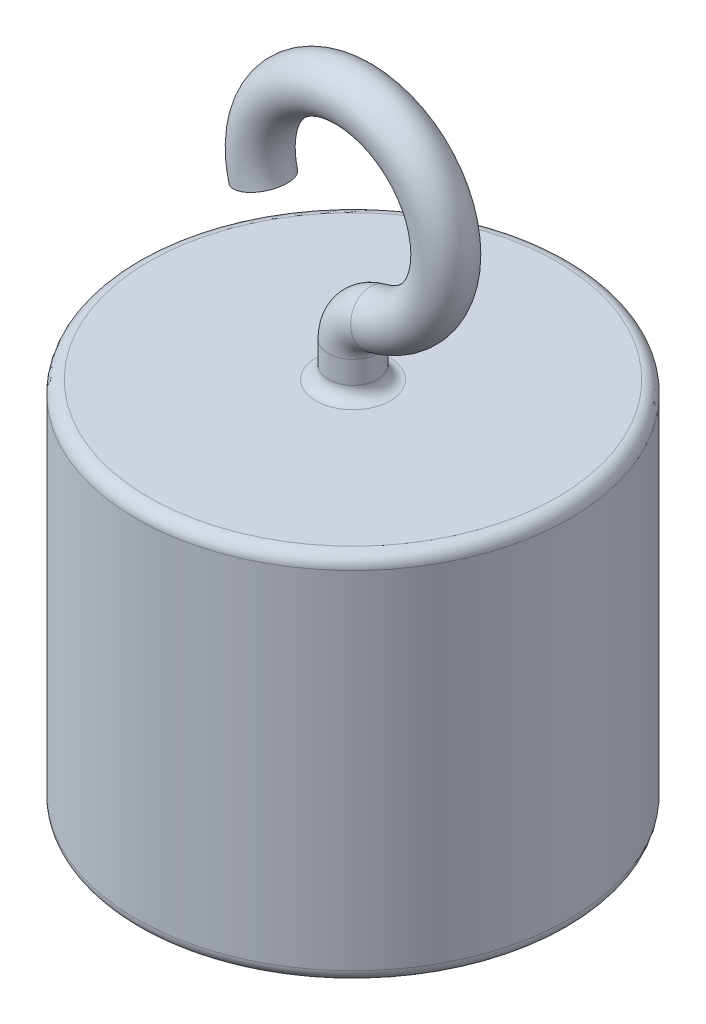
ISO-10303-21;
HEADER;
FILE_DESCRIPTION(('STEP AP214'),'2;1');
FILE_NAME('part.step','',(''),(''),'','','');
FILE_SCHEMA(('AUTOMOTIVE_DESIGN { 1 0 10303 214 1 1 1 1 }'));
ENDSEC;
DATA;
#1=APPLICATION_CONTEXT('core data for automotive mechanical design processes');
#2=APPLICATION_PROTOCOL_DEFINITION('international standard','automotive_design',2000,#1);
#3=PRODUCT_CONTEXT('',#1,'mechanical');
#4=PRODUCT('Part','Part','',(#3));
#5=PRODUCT_RELATED_PRODUCT_CATEGORY('part','',(#4));
#6=PRODUCT_DEFINITION_FORMATION('','',#4);
#7=PRODUCT_DEFINITION_CONTEXT('part definition',#1,'design');
#8=PRODUCT_DEFINITION('design','',#6,#7);
#9=PRODUCT_DEFINITION_SHAPE('','',#8);
#10=(LENGTH_UNIT() NAMED_UNIT(*) SI_UNIT(.MILLI.,.METRE.));
#11=(NAMED_UNIT(*) PLANE_ANGLE_UNIT() SI_UNIT($,.RADIAN.));
#12=(NAMED_UNIT(*) SI_UNIT($,.STERADIAN.) SOLID_ANGLE_UNIT());
#13=UNCERTAINTY_MEASURE_WITH_UNIT(LENGTH_MEASURE(1.E-05),#10,'distance_accuracy_value','');
#14=(GEOMETRIC_REPRESENTATION_CONTEXT(3) GLOBAL_UNCERTAINTY_ASSIGNED_CONTEXT((#13)) GLOBAL_UNIT_ASSIGNED_CONTEXT((#10,
#11,#12)) REPRESENTATION_CONTEXT('',''));
#15=CARTESIAN_POINT('',(0.,0.,0.));
#16=DIRECTION('',(0.,0.,1.));
#17=DIRECTION('',(1.,0.,0.));
#18=AXIS2_PLACEMENT_3D('',#15,#16,#17);
#19=CARTESIAN_POINT('',(0.,30.,0.));
#20=DIRECTION('',(0.,1.,0.));
#21=DIRECTION('',(-1.,0.,0.));
#22=AXIS2_PLACEMENT_3D('',#19,#20,#21);
#23=CYLINDRICAL_SURFACE('',#22,35.);
#24=CARTESIAN_POINT('',(0.,-28.,0.));
#25=DIRECTION('',(0.,-1.,0.));
#26=DIRECTION('',(1.,0.,0.));
#27=AXIS2_PLACEMENT_3D('',#24,#25,#26);
#28=CIRCLE('',#27,35.);
#29=CARTESIAN_POINT('',(35.,-28.,0.));
#30=VERTEX_POINT('',#29);
#31=EDGE_CURVE('E53',#30,#30,#28,.F.);
#32=ORIENTED_EDGE('',*,*,#31,.T.);
#33=EDGE_LOOP('',(#32));
#34=FACE_BOUND('',#33,.T.);
#35=CARTESIAN_POINT('',(0.,28.,0.));
#36=DIRECTION('',(0.,-1.,0.));
#37=DIRECTION('',(1.,0.,0.));
#38=AXIS2_PLACEMENT_3D('',#35,#36,#37);
#39=CIRCLE('',#38,35.);
#40=CARTESIAN_POINT('',(35.,28.,0.));
#41=VERTEX_POINT('',#40);
#42=EDGE_CURVE('E56',#41,#41,#39,.T.);
#43=ORIENTED_EDGE('',*,*,#42,.T.);
#44=EDGE_LOOP('',(#43));
#45=FACE_BOUND('',#44,.T.);
#46=ADVANCED_FACE('F33',(#34,#45),#23,.T.);
#47=CARTESIAN_POINT('',(0.,30.,0.));
#48=DIRECTION('',(0.,-1.,0.));
#49=DIRECTION('',(1.,0.,0.));
#50=AXIS2_PLACEMENT_3D('',#47,#48,#49);
#51=PLANE('',#50);
#52=CARTESIAN_POINT('',(0.,30.,0.));
#53=DIRECTION('',(0.,-1.,0.));
#54=DIRECTION('',(1.,0.,0.));
#55=AXIS2_PLACEMENT_3D('',#52,#53,#54);
#56=CIRCLE('',#55,6.);
#57=CARTESIAN_POINT('',(5.99999999999999,30.,0.));
#58=VERTEX_POINT('',#57);
#59=EDGE_CURVE('E10',#58,#58,#56,.T.);
#60=ORIENTED_EDGE('',*,*,#59,.T.);
#61=EDGE_LOOP('',(#60));
#62=FACE_BOUND('',#61,.T.);
#63=CARTESIAN_POINT('',(0.,30.,0.));
#64=DIRECTION('',(0.,-1.,0.));
#65=DIRECTION('',(1.,0.,0.));
#66=AXIS2_PLACEMENT_3D('',#63,#64,#65);
#67=CIRCLE('',#66,33.);
#68=CARTESIAN_POINT('',(33.,30.,0.));
#69=VERTEX_POINT('',#68);
#70=EDGE_CURVE('E44',#69,#69,#67,.F.);
#71=ORIENTED_EDGE('',*,*,#70,.T.);
#72=EDGE_LOOP('',(#71));
#73=FACE_BOUND('',#72,.T.);
#74=ADVANCED_FACE('F87',(#62,#73),#51,.F.);
#75=CARTESIAN_POINT('',(0.,-30.,0.));
#76=DIRECTION('',(0.,-1.,0.));
#77=DIRECTION('',(1.,0.,0.));
#78=AXIS2_PLACEMENT_3D('',#75,#76,#77);
#79=PLANE('',#78);
#80=CARTESIAN_POINT('',(0.,-30.,0.));
#81=DIRECTION('',(0.,-1.,0.));
#82=DIRECTION('',(0.,0.,-1.));
#83=AXIS2_PLACEMENT_3D('',#80,#81,#82);
#84=CIRCLE('',#83,20.);
#85=CARTESIAN_POINT('',(0.,-30.,-20.));
#86=VERTEX_POINT('',#85);
#87=EDGE_CURVE('E77',#86,#86,#84,.T.);
#88=ORIENTED_EDGE('',*,*,#87,.F.);
#89=EDGE_LOOP('',(#88));
#90=FACE_BOUND('',#89,.T.);
#91=CARTESIAN_POINT('',(0.,-30.,0.));
#92=DIRECTION('',(0.,-1.,0.));
#93=DIRECTION('',(1.,0.,0.));
#94=AXIS2_PLACEMENT_3D('',#91,#92,#93);
#95=CIRCLE('',#94,33.);
#96=CARTESIAN_POINT('',(33.,-30.,0.));
#97=VERTEX_POINT('',#96);
#98=EDGE_CURVE('E48',#97,#97,#95,.T.);
#99=ORIENTED_EDGE('',*,*,#98,.T.);
#100=EDGE_LOOP('',(#99));
#101=FACE_BOUND('',#100,.T.);
#102=ADVANCED_FACE('F83',(#90,#101),#79,.T.);
#103=CARTESIAN_POINT('',(0.,-28.,0.));
#104=DIRECTION('',(0.,-1.,0.));
#105=DIRECTION('',(1.,0.,0.));
#106=AXIS2_PLACEMENT_3D('',#103,#104,#105);
#107=TOROIDAL_SURFACE('',#106,33.,2.);
#108=ORIENTED_EDGE('',*,*,#98,.F.);
#109=EDGE_LOOP('',(#108));
#110=FACE_BOUND('',#109,.T.);
#111=ORIENTED_EDGE('',*,*,#31,.F.);
#112=EDGE_LOOP('',(#111));
#113=FACE_BOUND('',#112,.T.);
#114=ADVANCED_FACE('F86',(#110,#113),#107,.T.);
#115=CARTESIAN_POINT('',(0.,28.,0.));
#116=DIRECTION('',(0.,-1.,0.));
#117=DIRECTION('',(1.,0.,0.));
#118=AXIS2_PLACEMENT_3D('',#115,#116,#117);
#119=TOROIDAL_SURFACE('',#118,33.,2.);
#120=ORIENTED_EDGE('',*,*,#42,.F.);
#121=EDGE_LOOP('',(#120));
#122=FACE_BOUND('',#121,.T.);
#123=ORIENTED_EDGE('',*,*,#70,.F.);
#124=EDGE_LOOP('',(#123));
#125=FACE_BOUND('',#124,.T.);
#126=ADVANCED_FACE('F93',(#122,#125),#119,.T.);
#127=CARTESIAN_POINT('',(-14.488887394336,51.1177143234623,0.));
#128=DIRECTION('',(0.258819045102515,-0.96592582628907,0.));
#129=DIRECTION('',(0.96592582628907,0.258819045102515,0.));
#130=AXIS2_PLACEMENT_3D('',#127,#128,#129);
#131=PLANE('',#130);
#132=CARTESIAN_POINT('',(-14.488887394336,51.1177143234623,0.));
#133=DIRECTION('',(0.258819045102515,-0.96592582628907,0.));
#134=DIRECTION('',(0.96592582628907,0.258819045102515,0.));
#135=AXIS2_PLACEMENT_3D('',#132,#133,#134);
#136=CIRCLE('',#135,4.);
#137=CARTESIAN_POINT('',(-10.6251840891798,52.1529905038723,0.));
#138=VERTEX_POINT('',#137);
#139=EDGE_CURVE('E59',#138,#138,#136,.T.);
#140=ORIENTED_EDGE('',*,*,#139,.T.);
#141=EDGE_LOOP('',(#140));
#142=FACE_BOUND('',#141,.T.);
#143=ADVANCED_FACE('F104',(#142),#131,.T.);
#144=CARTESIAN_POINT('',(0.,30.,0.));
#145=DIRECTION('',(0.,1.,0.));
#146=DIRECTION('',(0.,0.,1.));
#147=AXIS2_PLACEMENT_3D('',#144,#145,#146);
#148=CYLINDRICAL_SURFACE('',#147,4.);
#149=CARTESIAN_POINT('',(0.,32.,0.));
#150=DIRECTION('',(0.,-1.,0.));
#151=DIRECTION('',(1.,0.,0.));
#152=AXIS2_PLACEMENT_3D('',#149,#150,#151);
#153=CIRCLE('',#152,4.);
#154=CARTESIAN_POINT('',(3.99999999999999,32.,0.));
#155=VERTEX_POINT('',#154);
#156=EDGE_CURVE('E40',#155,#155,#153,.F.);
#157=ORIENTED_EDGE('',*,*,#156,.T.);
#158=EDGE_LOOP('',(#157));
#159=FACE_BOUND('',#158,.T.);
#160=CARTESIAN_POINT('',(0.,35.6350832689629,0.));
#161=DIRECTION('',(0.,1.,0.));
#162=DIRECTION('',(-1.,0.,0.));
#163=AXIS2_PLACEMENT_3D('',#160,#161,#162);
#164=CIRCLE('',#163,4.);
#165=CARTESIAN_POINT('',(-4.,35.6350832689629,0.));
#166=VERTEX_POINT('',#165);
#167=EDGE_CURVE('E65',#166,#166,#164,.T.);
#168=ORIENTED_EDGE('',*,*,#167,.F.);
#169=EDGE_LOOP('',(#168));
#170=FACE_BOUND('',#169,.T.);
#171=ADVANCED_FACE('F115',(#159,#170),#148,.T.);
#172=CARTESIAN_POINT('',(5.,35.6350832689629,0.));
#173=DIRECTION('',(0.,0.,-1.));
#174=DIRECTION('',(-1.,0.,0.));
#175=AXIS2_PLACEMENT_3D('',#172,#173,#174);
#176=TOROIDAL_SURFACE('',#175,5.,4.);
#177=CARTESIAN_POINT('',(3.74999999999999,40.4763124517222,0.));
#178=DIRECTION('',(0.968245836551854,0.250000000000001,0.));
#179=DIRECTION('',(-0.250000000000001,0.968245836551854,0.));
#180=AXIS2_PLACEMENT_3D('',#177,#178,#179);
#181=CIRCLE('',#180,4.);
#182=CARTESIAN_POINT('',(2.74999999999999,44.3492957979296,0.));
#183=VERTEX_POINT('',#182);
#184=EDGE_CURVE('E62',#183,#183,#181,.T.);
#185=CARTESIAN_POINT('',(5.,35.6350832689629,0.));
#186=DIRECTION('',(0.,0.,-1.));
#187=DIRECTION('',(-1.,0.,0.));
#188=AXIS2_PLACEMENT_3D('',#185,#186,#187);
#189=CIRCLE('',#188,9.00000000000001);
#190=EDGE_CURVE('',#166,#183,#189,.T.);
#191=ORIENTED_EDGE('',*,*,#167,.T.);
#192=ORIENTED_EDGE('',*,*,#184,.F.);
#193=ORIENTED_EDGE('',*,*,#190,.T.);
#194=ORIENTED_EDGE('',*,*,#190,.F.);
#195=EDGE_LOOP('',(#191,#193,#192,#194));
#196=FACE_BOUND('',#195,.T.);
#197=ADVANCED_FACE('F119',(#196),#176,.T.);
#198=CARTESIAN_POINT('',(0.,55.,0.));
#199=DIRECTION('',(0.,0.,1.));
#200=DIRECTION('',(1.,0.,0.));
#201=AXIS2_PLACEMENT_3D('',#198,#199,#200);
#202=TOROIDAL_SURFACE('',#201,15.,4.);
#203=ORIENTED_EDGE('',*,*,#139,.F.);
#204=EDGE_LOOP('',(#203));
#205=FACE_BOUND('',#204,.T.);
#206=ORIENTED_EDGE('',*,*,#184,.T.);
#207=EDGE_LOOP('',(#206));
#208=FACE_BOUND('',#207,.T.);
#209=ADVANCED_FACE('F105',(#205,#208),#202,.T.);
#210=CARTESIAN_POINT('',(0.,32.,0.));
#211=DIRECTION('',(0.,-1.,0.));
#212=DIRECTION('',(1.,0.,0.));
#213=AXIS2_PLACEMENT_3D('',#210,#211,#212);
#214=TOROIDAL_SURFACE('',#213,6.,2.);
#215=ORIENTED_EDGE('',*,*,#59,.F.);
#216=EDGE_LOOP('',(#215));
#217=FACE_BOUND('',#216,.T.);
#218=ORIENTED_EDGE('',*,*,#156,.F.);
#219=EDGE_LOOP('',(#218));
#220=FACE_BOUND('',#219,.T.);
#221=ADVANCED_FACE('F35',(#217,#220),#214,.F.);
#222=CARTESIAN_POINT('',(0.,-20.,0.));
#223=DIRECTION('',(0.,1.,0.));
#224=DIRECTION('',(0.,0.,1.));
#225=AXIS2_PLACEMENT_3D('',#222,#223,#224);
#226=PLANE('',#225);
#227=CARTESIAN_POINT('',(0.,-20.,0.));
#228=DIRECTION('',(0.,-1.,0.));
#229=DIRECTION('',(0.,0.,-1.));
#230=AXIS2_PLACEMENT_3D('',#227,#228,#229);
#231=CIRCLE('',#230,3.);
#232=CARTESIAN_POINT('',(0.,-20.,-3.));
#233=VERTEX_POINT('',#232);
#234=EDGE_CURVE('E68',#233,#233,#231,.T.);
#235=ORIENTED_EDGE('',*,*,#234,.T.);
#236=EDGE_LOOP('',(#235));
#237=FACE_BOUND('',#236,.T.);
#238=ADVANCED_FACE('F126',(#237),#226,.F.);
#239=CARTESIAN_POINT('',(0.,-30.,0.));
#240=DIRECTION('',(0.,-1.,0.));
#241=DIRECTION('',(0.,0.,-1.));
#242=AXIS2_PLACEMENT_3D('',#239,#240,#241);
#243=CYLINDRICAL_SURFACE('',#242,3.);
#244=ORIENTED_EDGE('',*,*,#234,.F.);
#245=EDGE_LOOP('',(#244));
#246=FACE_BOUND('',#245,.T.);
#247=CARTESIAN_POINT('',(0.,-24.,0.));
#248=DIRECTION('',(0.,-1.,0.));
#249=DIRECTION('',(0.,0.,-1.));
#250=AXIS2_PLACEMENT_3D('',#247,#248,#249);
#251=CIRCLE('',#250,3.);
#252=CARTESIAN_POINT('',(0.,-24.,-3.));
#253=VERTEX_POINT('',#252);
#254=EDGE_CURVE('E71',#253,#253,#251,.T.);
#255=ORIENTED_EDGE('',*,*,#254,.T.);
#256=EDGE_LOOP('',(#255));
#257=FACE_BOUND('',#256,.T.);
#258=ADVANCED_FACE('F129',(#246,#257),#243,.F.);
#259=CARTESIAN_POINT('',(0.,-24.,0.));
#260=DIRECTION('',(0.,1.,0.));
#261=DIRECTION('',(0.,0.,1.));
#262=AXIS2_PLACEMENT_3D('',#259,#260,#261);
#263=PLANE('',#262);
#264=ORIENTED_EDGE('',*,*,#254,.F.);
#265=EDGE_LOOP('',(#264));
#266=FACE_BOUND('',#265,.T.);
#267=CARTESIAN_POINT('',(0.,-24.,0.));
#268=DIRECTION('',(0.,-1.,0.));
#269=DIRECTION('',(0.,0.,-1.));
#270=AXIS2_PLACEMENT_3D('',#267,#268,#269);
#271=CIRCLE('',#270,20.);
#272=CARTESIAN_POINT('',(0.,-24.,-20.));
#273=VERTEX_POINT('',#272);
#274=EDGE_CURVE('E74',#273,#273,#271,.T.);
#275=ORIENTED_EDGE('',*,*,#274,.T.);
#276=EDGE_LOOP('',(#275));
#277=FACE_BOUND('',#276,.T.);
#278=ADVANCED_FACE('F133',(#266,#277),#263,.F.);
#279=CARTESIAN_POINT('',(0.,-30.,0.));
#280=DIRECTION('',(0.,-1.,0.));
#281=DIRECTION('',(0.,0.,-1.));
#282=AXIS2_PLACEMENT_3D('',#279,#280,#281);
#283=CYLINDRICAL_SURFACE('',#282,20.);
#284=ORIENTED_EDGE('',*,*,#274,.F.);
#285=EDGE_LOOP('',(#284));
#286=FACE_BOUND('',#285,.T.);
#287=ORIENTED_EDGE('',*,*,#87,.T.);
#288=EDGE_LOOP('',(#287));
#289=FACE_BOUND('',#288,.T.);
#290=ADVANCED_FACE('F81',(#286,#289),#283,.F.);
#291=CLOSED_SHELL('',(#46,#74,#102,#114,#126,#143,#171,#197,#209,#221,#238,#258,#278,#290));
#292=MANIFOLD_SOLID_BREP('B2',#291);
#293=ADVANCED_BREP_SHAPE_REPRESENTATION('',(#18,#292),#14);
#294=SHAPE_DEFINITION_REPRESENTATION(#9,#293);
ENDSEC;
END-ISO-10303-21;
